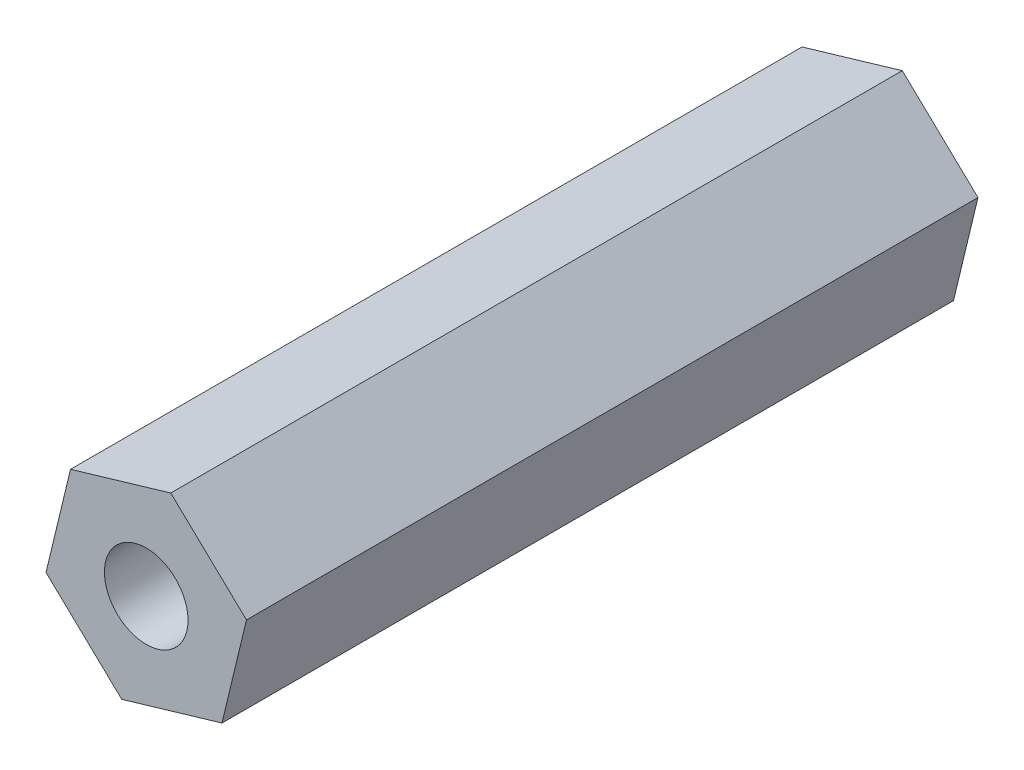
ISO-10303-21;
HEADER;
FILE_DESCRIPTION(('STEP AP214'),'2;1');
FILE_NAME('part.step','',(''),(''),'','','');
FILE_SCHEMA(('AUTOMOTIVE_DESIGN { 1 0 10303 214 1 1 1 1 }'));
ENDSEC;
DATA;
#1=APPLICATION_CONTEXT('core data for automotive mechanical design processes');
#2=APPLICATION_PROTOCOL_DEFINITION('international standard','automotive_design',2000,#1);
#3=PRODUCT_CONTEXT('',#1,'mechanical');
#4=PRODUCT('Part','Part','',(#3));
#5=PRODUCT_RELATED_PRODUCT_CATEGORY('part','',(#4));
#6=PRODUCT_DEFINITION_FORMATION('','',#4);
#7=PRODUCT_DEFINITION_CONTEXT('part definition',#1,'design');
#8=PRODUCT_DEFINITION('design','',#6,#7);
#9=PRODUCT_DEFINITION_SHAPE('','',#8);
#10=(LENGTH_UNIT() NAMED_UNIT(*) SI_UNIT(.MILLI.,.METRE.));
#11=(NAMED_UNIT(*) PLANE_ANGLE_UNIT() SI_UNIT($,.RADIAN.));
#12=(NAMED_UNIT(*) SI_UNIT($,.STERADIAN.) SOLID_ANGLE_UNIT());
#13=UNCERTAINTY_MEASURE_WITH_UNIT(LENGTH_MEASURE(1.E-05),#10,'distance_accuracy_value','');
#14=(GEOMETRIC_REPRESENTATION_CONTEXT(3) GLOBAL_UNCERTAINTY_ASSIGNED_CONTEXT((#13)) GLOBAL_UNIT_ASSIGNED_CONTEXT((#10,
#11,#12)) REPRESENTATION_CONTEXT('',''));
#15=CARTESIAN_POINT('',(0.,0.,0.));
#16=DIRECTION('',(0.,0.,1.));
#17=DIRECTION('',(1.,0.,0.));
#18=AXIS2_PLACEMENT_3D('',#15,#16,#17);
#19=CARTESIAN_POINT('',(-0.938021007151593,-3.88845941089042,28.));
#20=DIRECTION('',(-0.282969920992117,0.959128783747894,0.));
#21=DIRECTION('',(-0.959128783747894,-0.282969920992117,0.));
#22=AXIS2_PLACEMENT_3D('',#19,#20,#21);
#23=PLANE('',#22);
#24=DIRECTION('',(0.959128783747894,0.282969920992117,0.));
#25=VECTOR('',#24,1.);
#26=CARTESIAN_POINT('',(-0.938021007151593,-3.88845941089042,0.));
#27=LINE('',#26,#25);
#28=CARTESIAN_POINT('',(-0.938021007151593,-3.88845941089042,0.));
#29=VERTEX_POINT('',#28);
#30=CARTESIAN_POINT('',(2.89849412783998,-2.75657972692196,0.));
#31=VERTEX_POINT('',#30);
#32=EDGE_CURVE('E118',#29,#31,#27,.T.);
#33=ORIENTED_EDGE('',*,*,#32,.T.);
#34=DIRECTION('',(0.,0.,-1.));
#35=VECTOR('',#34,1.);
#36=CARTESIAN_POINT('',(2.89849412783998,-2.75657972692196,28.));
#37=LINE('',#36,#35);
#38=CARTESIAN_POINT('',(2.89849412783998,-2.75657972692196,28.));
#39=VERTEX_POINT('',#38);
#40=EDGE_CURVE('E11',#39,#31,#37,.T.);
#41=ORIENTED_EDGE('',*,*,#40,.F.);
#42=DIRECTION('',(0.959128783747894,0.282969920992117,0.));
#43=VECTOR('',#42,1.);
#44=CARTESIAN_POINT('',(-0.938021007151593,-3.88845941089042,28.));
#45=LINE('',#44,#43);
#46=CARTESIAN_POINT('',(-0.938021007151593,-3.88845941089042,28.));
#47=VERTEX_POINT('',#46);
#48=EDGE_CURVE('E129',#47,#39,#45,.T.);
#49=ORIENTED_EDGE('',*,*,#48,.F.);
#50=DIRECTION('',(0.,0.,-1.));
#51=VECTOR('',#50,1.);
#52=CARTESIAN_POINT('',(-0.938021007151593,-3.88845941089042,28.));
#53=LINE('',#52,#51);
#54=EDGE_CURVE('E114',#47,#29,#53,.T.);
#55=ORIENTED_EDGE('',*,*,#54,.T.);
#56=EDGE_LOOP('',(#33,#41,#49,#55));
#57=FACE_BOUND('',#56,.T.);
#58=ADVANCED_FACE('F34',(#57),#23,.F.);
#59=CARTESIAN_POINT('',(2.89849412783998,-2.75657972692196,28.));
#60=DIRECTION('',(-0.972114852722606,0.234505251787899,0.));
#61=DIRECTION('',(-0.234505251787899,-0.972114852722606,0.));
#62=AXIS2_PLACEMENT_3D('',#59,#60,#61);
#63=PLANE('',#62);
#64=DIRECTION('',(0.234505251787899,0.972114852722606,0.));
#65=VECTOR('',#64,1.);
#66=CARTESIAN_POINT('',(2.89849412783998,-2.75657972692196,0.));
#67=LINE('',#66,#65);
#68=CARTESIAN_POINT('',(3.83651513499158,1.13187968396847,0.));
#69=VERTEX_POINT('',#68);
#70=EDGE_CURVE('E121',#31,#69,#67,.T.);
#71=ORIENTED_EDGE('',*,*,#70,.T.);
#72=DIRECTION('',(0.,0.,-1.));
#73=VECTOR('',#72,1.);
#74=CARTESIAN_POINT('',(3.83651513499158,1.13187968396847,28.));
#75=LINE('',#74,#73);
#76=CARTESIAN_POINT('',(3.83651513499158,1.13187968396847,28.));
#77=VERTEX_POINT('',#76);
#78=EDGE_CURVE('E42',#77,#69,#75,.T.);
#79=ORIENTED_EDGE('',*,*,#78,.F.);
#80=DIRECTION('',(0.234505251787899,0.972114852722606,0.));
#81=VECTOR('',#80,1.);
#82=CARTESIAN_POINT('',(2.89849412783998,-2.75657972692196,28.));
#83=LINE('',#82,#81);
#84=EDGE_CURVE('E87',#39,#77,#83,.T.);
#85=ORIENTED_EDGE('',*,*,#84,.F.);
#86=ORIENTED_EDGE('',*,*,#40,.T.);
#87=EDGE_LOOP('',(#71,#79,#85,#86));
#88=FACE_BOUND('',#87,.T.);
#89=ADVANCED_FACE('F154',(#88),#63,.F.);
#90=CARTESIAN_POINT('',(3.83651513499158,1.13187968396847,28.));
#91=DIRECTION('',(-0.689144931730489,-0.724623531959996,0.));
#92=DIRECTION('',(0.724623531959996,-0.68914493173049,0.));
#93=AXIS2_PLACEMENT_3D('',#90,#91,#92);
#94=PLANE('',#93);
#95=DIRECTION('',(-0.724623531959996,0.68914493173049,0.));
#96=VECTOR('',#95,1.);
#97=CARTESIAN_POINT('',(3.83651513499158,1.13187968396847,0.));
#98=LINE('',#97,#96);
#99=CARTESIAN_POINT('',(0.938021007151594,3.88845941089042,0.));
#100=VERTEX_POINT('',#99);
#101=EDGE_CURVE('E124',#69,#100,#98,.T.);
#102=ORIENTED_EDGE('',*,*,#101,.T.);
#103=DIRECTION('',(0.,0.,-1.));
#104=VECTOR('',#103,1.);
#105=CARTESIAN_POINT('',(0.938021007151594,3.88845941089042,28.));
#106=LINE('',#105,#104);
#107=CARTESIAN_POINT('',(0.938021007151594,3.88845941089042,28.));
#108=VERTEX_POINT('',#107);
#109=EDGE_CURVE('E109',#108,#100,#106,.T.);
#110=ORIENTED_EDGE('',*,*,#109,.F.);
#111=DIRECTION('',(-0.724623531959996,0.68914493173049,0.));
#112=VECTOR('',#111,1.);
#113=CARTESIAN_POINT('',(3.83651513499158,1.13187968396847,28.));
#114=LINE('',#113,#112);
#115=EDGE_CURVE('E100',#77,#108,#114,.T.);
#116=ORIENTED_EDGE('',*,*,#115,.F.);
#117=ORIENTED_EDGE('',*,*,#78,.T.);
#118=EDGE_LOOP('',(#102,#110,#116,#117));
#119=FACE_BOUND('',#118,.T.);
#120=ADVANCED_FACE('F135',(#119),#94,.F.);
#121=CARTESIAN_POINT('',(0.938021007151594,3.88845941089042,28.));
#122=DIRECTION('',(0.282969920992117,-0.959128783747894,0.));
#123=DIRECTION('',(0.959128783747895,0.282969920992117,0.));
#124=AXIS2_PLACEMENT_3D('',#121,#122,#123);
#125=PLANE('',#124);
#126=DIRECTION('',(-0.959128783747895,-0.282969920992117,0.));
#127=VECTOR('',#126,1.);
#128=CARTESIAN_POINT('',(0.938021007151594,3.88845941089042,0.));
#129=LINE('',#128,#127);
#130=CARTESIAN_POINT('',(-2.89849412783998,2.75657972692196,0.));
#131=VERTEX_POINT('',#130);
#132=EDGE_CURVE('E108',#100,#131,#129,.T.);
#133=ORIENTED_EDGE('',*,*,#132,.T.);
#134=DIRECTION('',(0.,0.,-1.));
#135=VECTOR('',#134,1.);
#136=CARTESIAN_POINT('',(-2.89849412783998,2.75657972692196,28.));
#137=LINE('',#136,#135);
#138=CARTESIAN_POINT('',(-2.89849412783998,2.75657972692196,28.));
#139=VERTEX_POINT('',#138);
#140=EDGE_CURVE('E105',#139,#131,#137,.T.);
#141=ORIENTED_EDGE('',*,*,#140,.F.);
#142=DIRECTION('',(-0.959128783747895,-0.282969920992117,0.));
#143=VECTOR('',#142,1.);
#144=CARTESIAN_POINT('',(0.938021007151594,3.88845941089042,28.));
#145=LINE('',#144,#143);
#146=EDGE_CURVE('E94',#108,#139,#145,.T.);
#147=ORIENTED_EDGE('',*,*,#146,.F.);
#148=ORIENTED_EDGE('',*,*,#109,.T.);
#149=EDGE_LOOP('',(#133,#141,#147,#148));
#150=FACE_BOUND('',#149,.T.);
#151=ADVANCED_FACE('F106',(#150),#125,.F.);
#152=CARTESIAN_POINT('',(-2.89849412783998,2.75657972692196,28.));
#153=DIRECTION('',(0.972114852722606,-0.234505251787898,0.));
#154=DIRECTION('',(0.234505251787898,0.972114852722606,0.));
#155=AXIS2_PLACEMENT_3D('',#152,#153,#154);
#156=PLANE('',#155);
#157=DIRECTION('',(-0.234505251787898,-0.972114852722606,0.));
#158=VECTOR('',#157,1.);
#159=CARTESIAN_POINT('',(-2.89849412783998,2.75657972692196,0.));
#160=LINE('',#159,#158);
#161=CARTESIAN_POINT('',(-3.83651513499157,-1.13187968396847,0.));
#162=VERTEX_POINT('',#161);
#163=EDGE_CURVE('E73',#131,#162,#160,.T.);
#164=ORIENTED_EDGE('',*,*,#163,.T.);
#165=DIRECTION('',(0.,0.,-1.));
#166=VECTOR('',#165,1.);
#167=CARTESIAN_POINT('',(-3.83651513499157,-1.13187968396847,28.));
#168=LINE('',#167,#166);
#169=CARTESIAN_POINT('',(-3.83651513499157,-1.13187968396847,28.));
#170=VERTEX_POINT('',#169);
#171=EDGE_CURVE('E110',#170,#162,#168,.T.);
#172=ORIENTED_EDGE('',*,*,#171,.F.);
#173=DIRECTION('',(-0.234505251787898,-0.972114852722606,0.));
#174=VECTOR('',#173,1.);
#175=CARTESIAN_POINT('',(-2.89849412783998,2.75657972692196,28.));
#176=LINE('',#175,#174);
#177=EDGE_CURVE('E98',#139,#170,#176,.T.);
#178=ORIENTED_EDGE('',*,*,#177,.F.);
#179=ORIENTED_EDGE('',*,*,#140,.T.);
#180=EDGE_LOOP('',(#164,#172,#178,#179));
#181=FACE_BOUND('',#180,.T.);
#182=ADVANCED_FACE('F112',(#181),#156,.F.);
#183=CARTESIAN_POINT('',(-3.83651513499157,-1.13187968396847,28.));
#184=DIRECTION('',(0.689144931730489,0.724623531959996,0.));
#185=DIRECTION('',(-0.724623531959996,0.68914493173049,0.));
#186=AXIS2_PLACEMENT_3D('',#183,#184,#185);
#187=PLANE('',#186);
#188=DIRECTION('',(0.724623531959996,-0.68914493173049,0.));
#189=VECTOR('',#188,1.);
#190=CARTESIAN_POINT('',(-3.83651513499157,-1.13187968396847,0.));
#191=LINE('',#190,#189);
#192=EDGE_CURVE('E79',#162,#29,#191,.T.);
#193=ORIENTED_EDGE('',*,*,#192,.T.);
#194=ORIENTED_EDGE('',*,*,#54,.F.);
#195=DIRECTION('',(0.724623531959996,-0.68914493173049,0.));
#196=VECTOR('',#195,1.);
#197=CARTESIAN_POINT('',(-3.83651513499157,-1.13187968396847,28.));
#198=LINE('',#197,#196);
#199=EDGE_CURVE('E50',#170,#47,#198,.T.);
#200=ORIENTED_EDGE('',*,*,#199,.F.);
#201=ORIENTED_EDGE('',*,*,#171,.T.);
#202=EDGE_LOOP('',(#193,#194,#200,#201));
#203=FACE_BOUND('',#202,.T.);
#204=ADVANCED_FACE('F142',(#203),#187,.F.);
#205=CARTESIAN_POINT('',(0.,0.,28.));
#206=DIRECTION('',(0.,0.,1.));
#207=DIRECTION('',(1.,0.,0.));
#208=AXIS2_PLACEMENT_3D('',#205,#206,#207);
#209=PLANE('',#208);
#210=CARTESIAN_POINT('',(0.,0.,28.));
#211=DIRECTION('',(0.,0.,1.));
#212=DIRECTION('',(1.,0.,0.));
#213=AXIS2_PLACEMENT_3D('',#210,#211,#212);
#214=CIRCLE('',#213,1.6);
#215=CARTESIAN_POINT('',(1.6,0.,28.));
#216=VERTEX_POINT('',#215);
#217=EDGE_CURVE('E122',#216,#216,#214,.F.);
#218=ORIENTED_EDGE('',*,*,#217,.T.);
#219=EDGE_LOOP('',(#218));
#220=FACE_BOUND('',#219,.T.);
#221=ORIENTED_EDGE('',*,*,#48,.T.);
#222=ORIENTED_EDGE('',*,*,#84,.T.);
#223=ORIENTED_EDGE('',*,*,#115,.T.);
#224=ORIENTED_EDGE('',*,*,#146,.T.);
#225=ORIENTED_EDGE('',*,*,#177,.T.);
#226=ORIENTED_EDGE('',*,*,#199,.T.);
#227=EDGE_LOOP('',(#221,#222,#223,#224,#225,#226));
#228=FACE_BOUND('',#227,.T.);
#229=ADVANCED_FACE('F96',(#220,#228),#209,.T.);
#230=CARTESIAN_POINT('',(0.,0.,0.));
#231=DIRECTION('',(0.,0.,1.));
#232=DIRECTION('',(1.,0.,0.));
#233=AXIS2_PLACEMENT_3D('',#230,#231,#232);
#234=PLANE('',#233);
#235=CARTESIAN_POINT('',(0.,0.,0.));
#236=DIRECTION('',(0.,0.,1.));
#237=DIRECTION('',(1.,0.,0.));
#238=AXIS2_PLACEMENT_3D('',#235,#236,#237);
#239=CIRCLE('',#238,1.6);
#240=CARTESIAN_POINT('',(1.6,0.,0.));
#241=VERTEX_POINT('',#240);
#242=EDGE_CURVE('E209',#241,#241,#239,.T.);
#243=ORIENTED_EDGE('',*,*,#242,.T.);
#244=EDGE_LOOP('',(#243));
#245=FACE_BOUND('',#244,.T.);
#246=ORIENTED_EDGE('',*,*,#32,.F.);
#247=ORIENTED_EDGE('',*,*,#192,.F.);
#248=ORIENTED_EDGE('',*,*,#163,.F.);
#249=ORIENTED_EDGE('',*,*,#132,.F.);
#250=ORIENTED_EDGE('',*,*,#101,.F.);
#251=ORIENTED_EDGE('',*,*,#70,.F.);
#252=EDGE_LOOP('',(#246,#247,#248,#249,#250,#251));
#253=FACE_BOUND('',#252,.T.);
#254=ADVANCED_FACE('F138',(#245,#253),#234,.F.);
#255=CARTESIAN_POINT('',(0.,0.,48.));
#256=DIRECTION('',(0.,0.,-1.));
#257=DIRECTION('',(-1.,0.,0.));
#258=AXIS2_PLACEMENT_3D('',#255,#256,#257);
#259=CYLINDRICAL_SURFACE('',#258,1.6);
#260=ORIENTED_EDGE('',*,*,#217,.F.);
#261=EDGE_LOOP('',(#260));
#262=FACE_BOUND('',#261,.T.);
#263=ORIENTED_EDGE('',*,*,#242,.F.);
#264=EDGE_LOOP('',(#263));
#265=FACE_BOUND('',#264,.T.);
#266=ADVANCED_FACE('F191',(#262,#265),#259,.F.);
#267=CLOSED_SHELL('',(#58,#89,#120,#151,#182,#204,#229,#254,#266));
#268=MANIFOLD_SOLID_BREP('B2',#267);
#269=ADVANCED_BREP_SHAPE_REPRESENTATION('',(#18,#268),#14);
#270=SHAPE_DEFINITION_REPRESENTATION(#9,#269);
ENDSEC;
END-ISO-10303-21;
